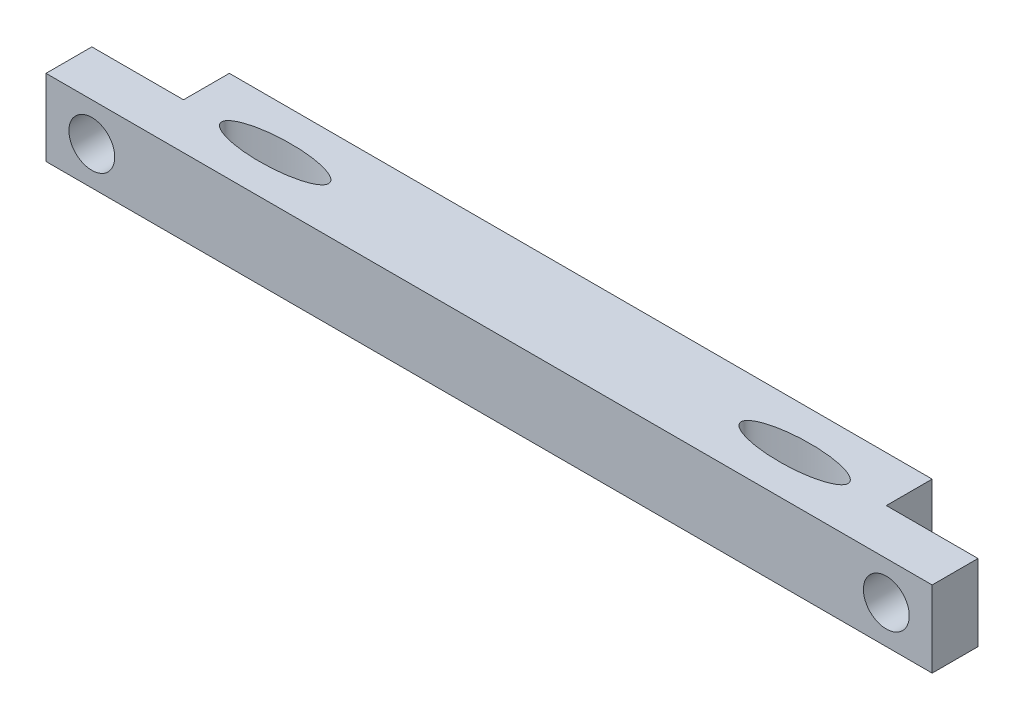
ISO-10303-21;
HEADER;
FILE_DESCRIPTION(('STEP AP214'),'2;1');
FILE_NAME('part.step','',(''),(''),'','','');
FILE_SCHEMA(('AUTOMOTIVE_DESIGN { 1 0 10303 214 1 1 1 1 }'));
ENDSEC;
DATA;
#1=APPLICATION_CONTEXT('core data for automotive mechanical design processes');
#2=APPLICATION_PROTOCOL_DEFINITION('international standard','automotive_design',2000,#1);
#3=PRODUCT_CONTEXT('',#1,'mechanical');
#4=PRODUCT('Part','Part','',(#3));
#5=PRODUCT_RELATED_PRODUCT_CATEGORY('part','',(#4));
#6=PRODUCT_DEFINITION_FORMATION('','',#4);
#7=PRODUCT_DEFINITION_CONTEXT('part definition',#1,'design');
#8=PRODUCT_DEFINITION('design','',#6,#7);
#9=PRODUCT_DEFINITION_SHAPE('','',#8);
#10=(LENGTH_UNIT() NAMED_UNIT(*) SI_UNIT(.MILLI.,.METRE.));
#11=(NAMED_UNIT(*) PLANE_ANGLE_UNIT() SI_UNIT($,.RADIAN.));
#12=(NAMED_UNIT(*) SI_UNIT($,.STERADIAN.) SOLID_ANGLE_UNIT());
#13=UNCERTAINTY_MEASURE_WITH_UNIT(LENGTH_MEASURE(1.E-05),#10,'distance_accuracy_value','');
#14=(GEOMETRIC_REPRESENTATION_CONTEXT(3) GLOBAL_UNCERTAINTY_ASSIGNED_CONTEXT((#13)) GLOBAL_UNIT_ASSIGNED_CONTEXT((#10,
#11,#12)) REPRESENTATION_CONTEXT('',''));
#15=CARTESIAN_POINT('',(0.,0.,0.));
#16=DIRECTION('',(0.,0.,1.));
#17=DIRECTION('',(1.,0.,0.));
#18=AXIS2_PLACEMENT_3D('',#15,#16,#17);
#19=CARTESIAN_POINT('',(-58.,5.,6.));
#20=DIRECTION('',(-1.,0.,0.));
#21=DIRECTION('',(0.,0.,1.));
#22=AXIS2_PLACEMENT_3D('',#19,#20,#21);
#23=PLANE('',#22);
#24=DIRECTION('',(0.,1.,0.));
#25=VECTOR('',#24,1.);
#26=CARTESIAN_POINT('',(-58.,-5.,0.));
#27=LINE('',#26,#25);
#28=CARTESIAN_POINT('',(-58.,-5.,0.));
#29=VERTEX_POINT('',#28);
#30=CARTESIAN_POINT('',(-58.,5.,0.));
#31=VERTEX_POINT('',#30);
#32=EDGE_CURVE('E137',#29,#31,#27,.T.);
#33=ORIENTED_EDGE('',*,*,#32,.F.);
#34=DIRECTION('',(0.,0.,-1.));
#35=VECTOR('',#34,1.);
#36=CARTESIAN_POINT('',(-58.,-5.,6.));
#37=LINE('',#36,#35);
#38=CARTESIAN_POINT('',(-58.,-5.,6.));
#39=VERTEX_POINT('',#38);
#40=EDGE_CURVE('E117',#39,#29,#37,.T.);
#41=ORIENTED_EDGE('',*,*,#40,.F.);
#42=DIRECTION('',(0.,-1.,0.));
#43=VECTOR('',#42,1.);
#44=CARTESIAN_POINT('',(-58.,5.,6.));
#45=LINE('',#44,#43);
#46=CARTESIAN_POINT('',(-58.,5.,6.));
#47=VERTEX_POINT('',#46);
#48=EDGE_CURVE('E11',#47,#39,#45,.T.);
#49=ORIENTED_EDGE('',*,*,#48,.F.);
#50=DIRECTION('',(0.,0.,-1.));
#51=VECTOR('',#50,1.);
#52=CARTESIAN_POINT('',(-58.,5.,6.));
#53=LINE('',#52,#51);
#54=EDGE_CURVE('E127',#47,#31,#53,.T.);
#55=ORIENTED_EDGE('',*,*,#54,.T.);
#56=EDGE_LOOP('',(#33,#41,#49,#55));
#57=FACE_BOUND('',#56,.T.);
#58=ADVANCED_FACE('F32',(#57),#23,.T.);
#59=CARTESIAN_POINT('',(58.,5.,6.));
#60=DIRECTION('',(0.,0.,1.));
#61=DIRECTION('',(1.,0.,0.));
#62=AXIS2_PLACEMENT_3D('',#59,#60,#61);
#63=PLANE('',#62);
#64=CARTESIAN_POINT('',(52.,0.,6.));
#65=DIRECTION('',(0.,0.,-1.));
#66=DIRECTION('',(0.,1.,0.));
#67=AXIS2_PLACEMENT_3D('',#64,#65,#66);
#68=CIRCLE('',#67,3.00000160106624);
#69=CARTESIAN_POINT('',(52.,3.00000160106624,6.));
#70=VERTEX_POINT('',#69);
#71=EDGE_CURVE('E325',#70,#70,#68,.T.);
#72=ORIENTED_EDGE('',*,*,#71,.T.);
#73=EDGE_LOOP('',(#72));
#74=FACE_BOUND('',#73,.T.);
#75=CARTESIAN_POINT('',(-52.,0.,6.));
#76=DIRECTION('',(0.,0.,-1.));
#77=DIRECTION('',(0.,1.,0.));
#78=AXIS2_PLACEMENT_3D('',#75,#76,#77);
#79=CIRCLE('',#78,3.00000160106624);
#80=CARTESIAN_POINT('',(-52.,3.00000160106624,6.));
#81=VERTEX_POINT('',#80);
#82=EDGE_CURVE('E217',#81,#81,#79,.T.);
#83=ORIENTED_EDGE('',*,*,#82,.T.);
#84=EDGE_LOOP('',(#83));
#85=FACE_BOUND('',#84,.T.);
#86=DIRECTION('',(-1.,0.,0.));
#87=VECTOR('',#86,1.);
#88=CARTESIAN_POINT('',(58.,-5.,6.));
#89=LINE('',#88,#87);
#90=CARTESIAN_POINT('',(58.,-5.,6.));
#91=VERTEX_POINT('',#90);
#92=EDGE_CURVE('E119',#91,#39,#89,.T.);
#93=ORIENTED_EDGE('',*,*,#92,.F.);
#94=DIRECTION('',(0.,-1.,0.));
#95=VECTOR('',#94,1.);
#96=CARTESIAN_POINT('',(58.,5.,6.));
#97=LINE('',#96,#95);
#98=CARTESIAN_POINT('',(58.,5.,6.));
#99=VERTEX_POINT('',#98);
#100=EDGE_CURVE('E35',#99,#91,#97,.T.);
#101=ORIENTED_EDGE('',*,*,#100,.F.);
#102=DIRECTION('',(-1.,0.,0.));
#103=VECTOR('',#102,1.);
#104=CARTESIAN_POINT('',(58.,5.,6.));
#105=LINE('',#104,#103);
#106=EDGE_CURVE('E140',#99,#47,#105,.T.);
#107=ORIENTED_EDGE('',*,*,#106,.T.);
#108=ORIENTED_EDGE('',*,*,#48,.T.);
#109=EDGE_LOOP('',(#93,#101,#107,#108));
#110=FACE_BOUND('',#109,.T.);
#111=ADVANCED_FACE('F151',(#74,#85,#110),#63,.T.);
#112=CARTESIAN_POINT('',(58.,5.,-6.));
#113=DIRECTION('',(1.,0.,0.));
#114=DIRECTION('',(0.,0.,-1.));
#115=AXIS2_PLACEMENT_3D('',#112,#113,#114);
#116=PLANE('',#115);
#117=DIRECTION('',(0.,1.,0.));
#118=VECTOR('',#117,1.);
#119=CARTESIAN_POINT('',(58.,-5.,0.));
#120=LINE('',#119,#118);
#121=CARTESIAN_POINT('',(58.,-5.,0.));
#122=VERTEX_POINT('',#121);
#123=CARTESIAN_POINT('',(58.,5.,0.));
#124=VERTEX_POINT('',#123);
#125=EDGE_CURVE('E163',#122,#124,#120,.T.);
#126=ORIENTED_EDGE('',*,*,#125,.T.);
#127=DIRECTION('',(0.,0.,1.));
#128=VECTOR('',#127,1.);
#129=CARTESIAN_POINT('',(58.,5.,-6.));
#130=LINE('',#129,#128);
#131=EDGE_CURVE('E134',#124,#99,#130,.T.);
#132=ORIENTED_EDGE('',*,*,#131,.T.);
#133=ORIENTED_EDGE('',*,*,#100,.T.);
#134=DIRECTION('',(0.,0.,1.));
#135=VECTOR('',#134,1.);
#136=CARTESIAN_POINT('',(58.,-5.,-6.));
#137=LINE('',#136,#135);
#138=EDGE_CURVE('E116',#122,#91,#137,.T.);
#139=ORIENTED_EDGE('',*,*,#138,.F.);
#140=EDGE_LOOP('',(#126,#132,#133,#139));
#141=FACE_BOUND('',#140,.T.);
#142=ADVANCED_FACE('F149',(#141),#116,.T.);
#143=CARTESIAN_POINT('',(-58.,5.,-6.));
#144=DIRECTION('',(0.,0.,-1.));
#145=DIRECTION('',(-1.,0.,0.));
#146=AXIS2_PLACEMENT_3D('',#143,#144,#145);
#147=PLANE('',#146);
#148=DIRECTION('',(0.,1.,0.));
#149=VECTOR('',#148,1.);
#150=CARTESIAN_POINT('',(46.,-5.,-6.));
#151=LINE('',#150,#149);
#152=CARTESIAN_POINT('',(46.,-5.,-6.));
#153=VERTEX_POINT('',#152);
#154=CARTESIAN_POINT('',(46.,5.,-6.));
#155=VERTEX_POINT('',#154);
#156=EDGE_CURVE('E98',#153,#155,#151,.T.);
#157=ORIENTED_EDGE('',*,*,#156,.F.);
#158=DIRECTION('',(1.,0.,0.));
#159=VECTOR('',#158,1.);
#160=CARTESIAN_POINT('',(-58.,-5.,-6.));
#161=LINE('',#160,#159);
#162=CARTESIAN_POINT('',(-46.,-5.,-6.));
#163=VERTEX_POINT('',#162);
#164=EDGE_CURVE('E110',#163,#153,#161,.T.);
#165=ORIENTED_EDGE('',*,*,#164,.F.);
#166=DIRECTION('',(0.,1.,0.));
#167=VECTOR('',#166,1.);
#168=CARTESIAN_POINT('',(-46.,-5.,-6.));
#169=LINE('',#168,#167);
#170=CARTESIAN_POINT('',(-46.,5.,-6.));
#171=VERTEX_POINT('',#170);
#172=EDGE_CURVE('E122',#163,#171,#169,.T.);
#173=ORIENTED_EDGE('',*,*,#172,.T.);
#174=DIRECTION('',(1.,0.,0.));
#175=VECTOR('',#174,1.);
#176=CARTESIAN_POINT('',(-58.,5.,-6.));
#177=LINE('',#176,#175);
#178=EDGE_CURVE('E112',#171,#155,#177,.T.);
#179=ORIENTED_EDGE('',*,*,#178,.T.);
#180=EDGE_LOOP('',(#157,#165,#173,#179));
#181=FACE_BOUND('',#180,.T.);
#182=ADVANCED_FACE('F108',(#181),#147,.T.);
#183=CARTESIAN_POINT('',(0.,5.,0.));
#184=DIRECTION('',(0.,-1.,0.));
#185=DIRECTION('',(0.,0.,-1.));
#186=AXIS2_PLACEMENT_3D('',#183,#184,#185);
#187=PLANE('',#186);
#188=CARTESIAN_POINT('',(-34.,5.,0.));
#189=DIRECTION('',(0.,1.,0.));
#190=DIRECTION('',(-1.,0.,0.));
#191=AXIS2_PLACEMENT_3D('',#188,#189,#190);
#192=ELLIPSE('',#191,7.00000000000001,2.03764);
#193=CARTESIAN_POINT('',(-41.,5.,0.));
#194=VERTEX_POINT('',#193);
#195=EDGE_CURVE('E207',#194,#194,#192,.T.);
#196=ORIENTED_EDGE('',*,*,#195,.F.);
#197=EDGE_LOOP('',(#196));
#198=FACE_BOUND('',#197,.T.);
#199=CARTESIAN_POINT('',(34.,5.,0.));
#200=DIRECTION('',(0.,-1.,0.));
#201=DIRECTION('',(1.,0.,0.));
#202=AXIS2_PLACEMENT_3D('',#199,#200,#201);
#203=ELLIPSE('',#202,7.,2.03764);
#204=CARTESIAN_POINT('',(41.,5.,0.));
#205=VERTEX_POINT('',#204);
#206=EDGE_CURVE('E210',#205,#205,#203,.T.);
#207=ORIENTED_EDGE('',*,*,#206,.T.);
#208=EDGE_LOOP('',(#207));
#209=FACE_BOUND('',#208,.T.);
#210=ORIENTED_EDGE('',*,*,#131,.F.);
#211=DIRECTION('',(1.,0.,0.));
#212=VECTOR('',#211,1.);
#213=CARTESIAN_POINT('',(46.,5.,0.));
#214=LINE('',#213,#212);
#215=CARTESIAN_POINT('',(46.,5.,0.));
#216=VERTEX_POINT('',#215);
#217=EDGE_CURVE('E103',#216,#124,#214,.T.);
#218=ORIENTED_EDGE('',*,*,#217,.F.);
#219=DIRECTION('',(0.,0.,1.));
#220=VECTOR('',#219,1.);
#221=CARTESIAN_POINT('',(46.,5.,-6.));
#222=LINE('',#221,#220);
#223=EDGE_CURVE('E212',#155,#216,#222,.T.);
#224=ORIENTED_EDGE('',*,*,#223,.F.);
#225=ORIENTED_EDGE('',*,*,#178,.F.);
#226=DIRECTION('',(0.,0.,-1.));
#227=VECTOR('',#226,1.);
#228=CARTESIAN_POINT('',(-46.,5.,0.));
#229=LINE('',#228,#227);
#230=CARTESIAN_POINT('',(-46.,5.,0.));
#231=VERTEX_POINT('',#230);
#232=EDGE_CURVE('E155',#231,#171,#229,.T.);
#233=ORIENTED_EDGE('',*,*,#232,.F.);
#234=DIRECTION('',(1.,0.,0.));
#235=VECTOR('',#234,1.);
#236=CARTESIAN_POINT('',(-58.,5.,0.));
#237=LINE('',#236,#235);
#238=EDGE_CURVE('E158',#31,#231,#237,.T.);
#239=ORIENTED_EDGE('',*,*,#238,.F.);
#240=ORIENTED_EDGE('',*,*,#54,.F.);
#241=ORIENTED_EDGE('',*,*,#106,.F.);
#242=EDGE_LOOP('',(#210,#218,#224,#225,#233,#239,#240,#241));
#243=FACE_BOUND('',#242,.T.);
#244=ADVANCED_FACE('F170',(#198,#209,#243),#187,.F.);
#245=CARTESIAN_POINT('',(0.,-5.,0.));
#246=DIRECTION('',(0.,-1.,0.));
#247=DIRECTION('',(0.,0.,-1.));
#248=AXIS2_PLACEMENT_3D('',#245,#246,#247);
#249=PLANE('',#248);
#250=CARTESIAN_POINT('',(-34.,-5.,0.));
#251=DIRECTION('',(0.,1.,0.));
#252=DIRECTION('',(-1.,0.,0.));
#253=AXIS2_PLACEMENT_3D('',#250,#251,#252);
#254=ELLIPSE('',#253,7.00000000000001,2.03764);
#255=CARTESIAN_POINT('',(-41.,-5.,0.));
#256=VERTEX_POINT('',#255);
#257=EDGE_CURVE('E319',#256,#256,#254,.T.);
#258=ORIENTED_EDGE('',*,*,#257,.T.);
#259=EDGE_LOOP('',(#258));
#260=FACE_BOUND('',#259,.T.);
#261=CARTESIAN_POINT('',(34.,-5.,0.));
#262=DIRECTION('',(0.,-1.,0.));
#263=DIRECTION('',(1.,0.,0.));
#264=AXIS2_PLACEMENT_3D('',#261,#262,#263);
#265=ELLIPSE('',#264,7.,2.03764);
#266=CARTESIAN_POINT('',(41.,-5.,0.));
#267=VERTEX_POINT('',#266);
#268=EDGE_CURVE('E213',#267,#267,#265,.T.);
#269=ORIENTED_EDGE('',*,*,#268,.F.);
#270=EDGE_LOOP('',(#269));
#271=FACE_BOUND('',#270,.T.);
#272=DIRECTION('',(1.,0.,0.));
#273=VECTOR('',#272,1.);
#274=CARTESIAN_POINT('',(46.,-5.,0.));
#275=LINE('',#274,#273);
#276=CARTESIAN_POINT('',(46.,-5.,0.));
#277=VERTEX_POINT('',#276);
#278=EDGE_CURVE('E46',#277,#122,#275,.T.);
#279=ORIENTED_EDGE('',*,*,#278,.T.);
#280=ORIENTED_EDGE('',*,*,#138,.T.);
#281=ORIENTED_EDGE('',*,*,#92,.T.);
#282=ORIENTED_EDGE('',*,*,#40,.T.);
#283=DIRECTION('',(1.,0.,0.));
#284=VECTOR('',#283,1.);
#285=CARTESIAN_POINT('',(-58.,-5.,0.));
#286=LINE('',#285,#284);
#287=CARTESIAN_POINT('',(-46.,-5.,0.));
#288=VERTEX_POINT('',#287);
#289=EDGE_CURVE('E153',#29,#288,#286,.T.);
#290=ORIENTED_EDGE('',*,*,#289,.T.);
#291=DIRECTION('',(0.,0.,-1.));
#292=VECTOR('',#291,1.);
#293=CARTESIAN_POINT('',(-46.,-5.,0.));
#294=LINE('',#293,#292);
#295=EDGE_CURVE('E54',#288,#163,#294,.T.);
#296=ORIENTED_EDGE('',*,*,#295,.T.);
#297=ORIENTED_EDGE('',*,*,#164,.T.);
#298=DIRECTION('',(0.,0.,1.));
#299=VECTOR('',#298,1.);
#300=CARTESIAN_POINT('',(46.,-5.,-6.));
#301=LINE('',#300,#299);
#302=EDGE_CURVE('E94',#153,#277,#301,.T.);
#303=ORIENTED_EDGE('',*,*,#302,.T.);
#304=EDGE_LOOP('',(#279,#280,#281,#282,#290,#296,#297,#303));
#305=FACE_BOUND('',#304,.T.);
#306=ADVANCED_FACE('F114',(#260,#271,#305),#249,.T.);
#307=CARTESIAN_POINT('',(-46.,-5.,0.));
#308=DIRECTION('',(1.,0.,0.));
#309=DIRECTION('',(0.,0.,-1.));
#310=AXIS2_PLACEMENT_3D('',#307,#308,#309);
#311=PLANE('',#310);
#312=ORIENTED_EDGE('',*,*,#232,.T.);
#313=ORIENTED_EDGE('',*,*,#172,.F.);
#314=ORIENTED_EDGE('',*,*,#295,.F.);
#315=DIRECTION('',(0.,1.,0.));
#316=VECTOR('',#315,1.);
#317=CARTESIAN_POINT('',(-46.,-5.,0.));
#318=LINE('',#317,#316);
#319=EDGE_CURVE('E165',#288,#231,#318,.T.);
#320=ORIENTED_EDGE('',*,*,#319,.T.);
#321=EDGE_LOOP('',(#312,#313,#314,#320));
#322=FACE_BOUND('',#321,.T.);
#323=ADVANCED_FACE('F171',(#322),#311,.F.);
#324=CARTESIAN_POINT('',(-58.,-5.,0.));
#325=DIRECTION('',(0.,0.,1.));
#326=DIRECTION('',(0.,-1.,0.));
#327=AXIS2_PLACEMENT_3D('',#324,#325,#326);
#328=PLANE('',#327);
#329=CARTESIAN_POINT('',(-52.,0.,0.));
#330=DIRECTION('',(0.,0.,-1.));
#331=DIRECTION('',(0.,1.,0.));
#332=AXIS2_PLACEMENT_3D('',#329,#330,#331);
#333=CIRCLE('',#332,3.00000160106624);
#334=CARTESIAN_POINT('',(-52.,3.00000160106624,0.));
#335=VERTEX_POINT('',#334);
#336=EDGE_CURVE('E221',#335,#335,#333,.T.);
#337=ORIENTED_EDGE('',*,*,#336,.F.);
#338=EDGE_LOOP('',(#337));
#339=FACE_BOUND('',#338,.T.);
#340=ORIENTED_EDGE('',*,*,#238,.T.);
#341=ORIENTED_EDGE('',*,*,#319,.F.);
#342=ORIENTED_EDGE('',*,*,#289,.F.);
#343=ORIENTED_EDGE('',*,*,#32,.T.);
#344=EDGE_LOOP('',(#340,#341,#342,#343));
#345=FACE_BOUND('',#344,.T.);
#346=ADVANCED_FACE('F167',(#339,#345),#328,.F.);
#347=CARTESIAN_POINT('',(46.,-5.,0.));
#348=DIRECTION('',(0.,0.,1.));
#349=DIRECTION('',(0.,-1.,0.));
#350=AXIS2_PLACEMENT_3D('',#347,#348,#349);
#351=PLANE('',#350);
#352=CARTESIAN_POINT('',(52.,0.,0.));
#353=DIRECTION('',(0.,0.,-1.));
#354=DIRECTION('',(0.,1.,0.));
#355=AXIS2_PLACEMENT_3D('',#352,#353,#354);
#356=CIRCLE('',#355,3.00000160106624);
#357=CARTESIAN_POINT('',(52.,3.00000160106624,0.));
#358=VERTEX_POINT('',#357);
#359=EDGE_CURVE('E323',#358,#358,#356,.T.);
#360=ORIENTED_EDGE('',*,*,#359,.F.);
#361=EDGE_LOOP('',(#360));
#362=FACE_BOUND('',#361,.T.);
#363=ORIENTED_EDGE('',*,*,#217,.T.);
#364=ORIENTED_EDGE('',*,*,#125,.F.);
#365=ORIENTED_EDGE('',*,*,#278,.F.);
#366=DIRECTION('',(0.,1.,0.));
#367=VECTOR('',#366,1.);
#368=CARTESIAN_POINT('',(46.,-5.,0.));
#369=LINE('',#368,#367);
#370=EDGE_CURVE('E100',#277,#216,#369,.T.);
#371=ORIENTED_EDGE('',*,*,#370,.T.);
#372=EDGE_LOOP('',(#363,#364,#365,#371));
#373=FACE_BOUND('',#372,.T.);
#374=ADVANCED_FACE('F178',(#362,#373),#351,.F.);
#375=CARTESIAN_POINT('',(46.,-5.,-6.));
#376=DIRECTION('',(-1.,0.,0.));
#377=DIRECTION('',(0.,0.,1.));
#378=AXIS2_PLACEMENT_3D('',#375,#376,#377);
#379=PLANE('',#378);
#380=ORIENTED_EDGE('',*,*,#223,.T.);
#381=ORIENTED_EDGE('',*,*,#370,.F.);
#382=ORIENTED_EDGE('',*,*,#302,.F.);
#383=ORIENTED_EDGE('',*,*,#156,.T.);
#384=EDGE_LOOP('',(#380,#381,#382,#383));
#385=FACE_BOUND('',#384,.T.);
#386=ADVANCED_FACE('F97',(#385),#379,.F.);
#387=DIRECTION('',(0.,-1.,0.));
#388=VECTOR('',#387,1.);
#389=SURFACE_OF_LINEAR_EXTRUSION('',#203,#388);
#390=ORIENTED_EDGE('',*,*,#206,.F.);
#391=EDGE_LOOP('',(#390));
#392=FACE_BOUND('',#391,.T.);
#393=ORIENTED_EDGE('',*,*,#268,.T.);
#394=EDGE_LOOP('',(#393));
#395=FACE_BOUND('',#394,.T.);
#396=ADVANCED_FACE('F224',(#392,#395),#389,.F.);
#397=CARTESIAN_POINT('',(-52.,0.,6.));
#398=DIRECTION('',(0.,0.,-1.));
#399=DIRECTION('',(0.,1.,0.));
#400=AXIS2_PLACEMENT_3D('',#397,#398,#399);
#401=CYLINDRICAL_SURFACE('',#400,3.00000160106624);
#402=CARTESIAN_POINT('',(-52.,3.00000160106624,6.));
#403=CARTESIAN_POINT('',(-52.,3.00000160106624,5.9375));
#404=CARTESIAN_POINT('',(-52.,3.00000160106624,5.875));
#405=CARTESIAN_POINT('',(-52.,3.00000160106624,5.75));
#406=CARTESIAN_POINT('',(-52.,3.00000160106624,5.6875));
#407=CARTESIAN_POINT('',(-52.,3.00000160106624,5.5625));
#408=CARTESIAN_POINT('',(-52.,3.00000160106624,5.5));
#409=CARTESIAN_POINT('',(-52.,3.00000160106624,5.375));
#410=CARTESIAN_POINT('',(-52.,3.00000160106624,5.3125));
#411=CARTESIAN_POINT('',(-52.,3.00000160106624,5.1875));
#412=CARTESIAN_POINT('',(-52.,3.00000160106624,5.125));
#413=CARTESIAN_POINT('',(-52.,3.00000160106624,5.));
#414=CARTESIAN_POINT('',(-52.,3.00000160106624,4.9375));
#415=CARTESIAN_POINT('',(-52.,3.00000160106624,4.8125));
#416=CARTESIAN_POINT('',(-52.,3.00000160106624,4.75));
#417=CARTESIAN_POINT('',(-52.,3.00000160106624,4.625));
#418=CARTESIAN_POINT('',(-52.,3.00000160106624,4.5625));
#419=CARTESIAN_POINT('',(-52.,3.00000160106624,4.4375));
#420=CARTESIAN_POINT('',(-52.,3.00000160106624,4.375));
#421=CARTESIAN_POINT('',(-52.,3.00000160106624,4.25));
#422=CARTESIAN_POINT('',(-52.,3.00000160106624,4.1875));
#423=CARTESIAN_POINT('',(-52.,3.00000160106624,4.0625));
#424=CARTESIAN_POINT('',(-52.,3.00000160106624,4.));
#425=CARTESIAN_POINT('',(-52.,3.00000160106624,3.875));
#426=CARTESIAN_POINT('',(-52.,3.00000160106624,3.8125));
#427=CARTESIAN_POINT('',(-52.,3.00000160106624,3.6875));
#428=CARTESIAN_POINT('',(-52.,3.00000160106624,3.625));
#429=CARTESIAN_POINT('',(-52.,3.00000160106624,3.5));
#430=CARTESIAN_POINT('',(-52.,3.00000160106624,3.4375));
#431=CARTESIAN_POINT('',(-52.,3.00000160106624,3.3125));
#432=CARTESIAN_POINT('',(-52.,3.00000160106624,3.25));
#433=CARTESIAN_POINT('',(-52.,3.00000160106624,3.125));
#434=CARTESIAN_POINT('',(-52.,3.00000160106624,3.0625));
#435=CARTESIAN_POINT('',(-52.,3.00000160106624,2.9375));
#436=CARTESIAN_POINT('',(-52.,3.00000160106624,2.875));
#437=CARTESIAN_POINT('',(-52.,3.00000160106624,2.75));
#438=CARTESIAN_POINT('',(-52.,3.00000160106624,2.6875));
#439=CARTESIAN_POINT('',(-52.,3.00000160106624,2.5625));
#440=CARTESIAN_POINT('',(-52.,3.00000160106624,2.5));
#441=CARTESIAN_POINT('',(-52.,3.00000160106624,2.375));
#442=CARTESIAN_POINT('',(-52.,3.00000160106624,2.3125));
#443=CARTESIAN_POINT('',(-52.,3.00000160106624,2.1875));
#444=CARTESIAN_POINT('',(-52.,3.00000160106624,2.125));
#445=CARTESIAN_POINT('',(-52.,3.00000160106624,2.));
#446=CARTESIAN_POINT('',(-52.,3.00000160106624,1.9375));
#447=CARTESIAN_POINT('',(-52.,3.00000160106624,1.8125));
#448=CARTESIAN_POINT('',(-52.,3.00000160106624,1.75));
#449=CARTESIAN_POINT('',(-52.,3.00000160106624,1.625));
#450=CARTESIAN_POINT('',(-52.,3.00000160106624,1.5625));
#451=CARTESIAN_POINT('',(-52.,3.00000160106624,1.4375));
#452=CARTESIAN_POINT('',(-52.,3.00000160106624,1.375));
#453=CARTESIAN_POINT('',(-52.,3.00000160106624,1.25));
#454=CARTESIAN_POINT('',(-52.,3.00000160106624,1.1875));
#455=CARTESIAN_POINT('',(-52.,3.00000160106624,1.0625));
#456=CARTESIAN_POINT('',(-52.,3.00000160106624,1.));
#457=CARTESIAN_POINT('',(-52.,3.00000160106624,0.875000000000001));
#458=CARTESIAN_POINT('',(-52.,3.00000160106624,0.812500000000001));
#459=CARTESIAN_POINT('',(-52.,3.00000160106624,0.687500000000001));
#460=CARTESIAN_POINT('',(-52.,3.00000160106624,0.625000000000001));
#461=CARTESIAN_POINT('',(-52.,3.00000160106624,0.5));
#462=CARTESIAN_POINT('',(-52.,3.00000160106624,0.4375));
#463=CARTESIAN_POINT('',(-52.,3.00000160106624,0.3125));
#464=CARTESIAN_POINT('',(-52.,3.00000160106624,0.25));
#465=CARTESIAN_POINT('',(-52.,3.00000160106624,0.125));
#466=CARTESIAN_POINT('',(-52.,3.00000160106624,0.0625000000000001));
#467=CARTESIAN_POINT('',(-52.,3.00000160106624,0.));
#468=B_SPLINE_CURVE_WITH_KNOTS('',3,(#402,#403,#404,#405,#406,#407,#408,#409,#410,#411,#412,
#413,#414,#415,#416,#417,#418,#419,#420,#421,#422,#423,#424,#425,#426,#427,#428,#429,#430,#431,
#432,#433,#434,#435,#436,#437,#438,#439,#440,#441,#442,#443,#444,#445,#446,#447,#448,#449,#450,
#451,#452,#453,#454,#455,#456,#457,#458,#459,#460,#461,#462,#463,#464,#465,#466,#467),
.UNSPECIFIED.,.F.,.F.,(4,2,2,2,2,2,2,2,2,2,2,2,2,2,2,2,2,2,2,2,2,2,2,2,2,2,2,2,2,2,2,2,4),(0.,
0.1875,0.375,0.5625,0.750000000000001,0.937500000000001,1.125,1.3125,1.5,1.6875,1.875,2.0625,
2.25,2.4375,2.625,2.8125,3.,3.1875,3.375,3.5625,3.75,3.9375,4.125,4.3125,4.5,4.6875,4.875,
5.0625,5.25,5.4375,5.625,5.8125,6.),.UNSPECIFIED.);
#469=EDGE_CURVE('BSEAM228',#81,#335,#468,.T.);
#470=ORIENTED_EDGE('',*,*,#82,.F.);
#471=ORIENTED_EDGE('',*,*,#336,.T.);
#472=ORIENTED_EDGE('',*,*,#469,.T.);
#473=ORIENTED_EDGE('',*,*,#469,.F.);
#474=EDGE_LOOP('',(#470,#472,#471,#473));
#475=FACE_BOUND('',#474,.T.);
#476=ADVANCED_FACE('F228',(#475),#401,.F.);
#477=CARTESIAN_POINT('',(52.,0.,6.));
#478=DIRECTION('',(0.,0.,-1.));
#479=DIRECTION('',(0.,1.,0.));
#480=AXIS2_PLACEMENT_3D('',#477,#478,#479);
#481=CYLINDRICAL_SURFACE('',#480,3.00000160106624);
#482=ORIENTED_EDGE('',*,*,#71,.F.);
#483=EDGE_LOOP('',(#482));
#484=FACE_BOUND('',#483,.T.);
#485=ORIENTED_EDGE('',*,*,#359,.T.);
#486=EDGE_LOOP('',(#485));
#487=FACE_BOUND('',#486,.T.);
#488=ADVANCED_FACE('F248',(#484,#487),#481,.F.);
#489=DIRECTION('',(0.,1.,0.));
#490=VECTOR('',#489,1.);
#491=SURFACE_OF_LINEAR_EXTRUSION('',#254,#490);
#492=ORIENTED_EDGE('',*,*,#257,.F.);
#493=EDGE_LOOP('',(#492));
#494=FACE_BOUND('',#493,.T.);
#495=ORIENTED_EDGE('',*,*,#195,.T.);
#496=EDGE_LOOP('',(#495));
#497=FACE_BOUND('',#496,.T.);
#498=ADVANCED_FACE('F255',(#494,#497),#491,.F.);
#499=CLOSED_SHELL('',(#58,#111,#142,#182,#244,#306,#323,#346,#374,#386,#396,#476,#488,#498));
#500=MANIFOLD_SOLID_BREP('B2',#499);
#501=ADVANCED_BREP_SHAPE_REPRESENTATION('',(#18,#500),#14);
#502=SHAPE_DEFINITION_REPRESENTATION(#9,#501);
ENDSEC;
END-ISO-10303-21;
